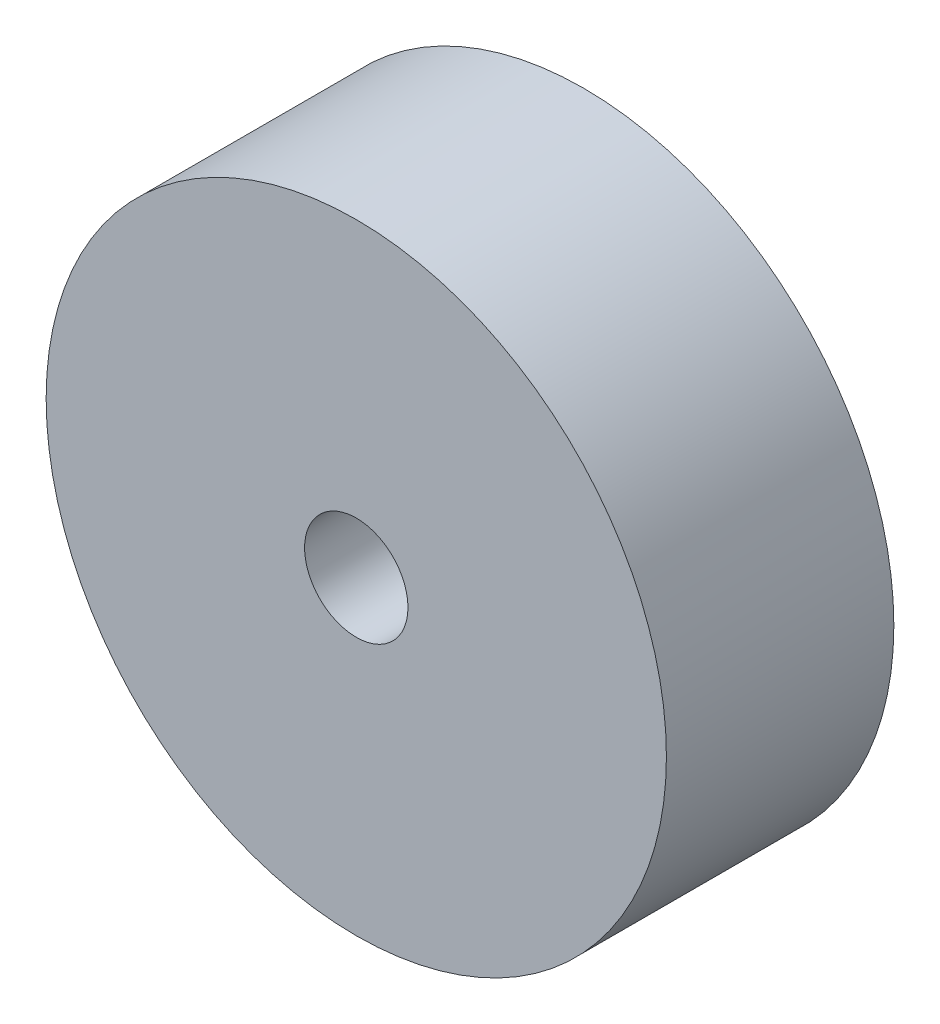
ISO-10303-21;
HEADER;
FILE_DESCRIPTION(('STEP AP214'),'2;1');
FILE_NAME('part.step','',(''),(''),'','','');
FILE_SCHEMA(('AUTOMOTIVE_DESIGN { 1 0 10303 214 1 1 1 1 }'));
ENDSEC;
DATA;
#1=APPLICATION_CONTEXT('core data for automotive mechanical design processes');
#2=APPLICATION_PROTOCOL_DEFINITION('international standard','automotive_design',2000,#1);
#3=PRODUCT_CONTEXT('',#1,'mechanical');
#4=PRODUCT('Part','Part','',(#3));
#5=PRODUCT_RELATED_PRODUCT_CATEGORY('part','',(#4));
#6=PRODUCT_DEFINITION_FORMATION('','',#4);
#7=PRODUCT_DEFINITION_CONTEXT('part definition',#1,'design');
#8=PRODUCT_DEFINITION('design','',#6,#7);
#9=PRODUCT_DEFINITION_SHAPE('','',#8);
#10=(LENGTH_UNIT() NAMED_UNIT(*) SI_UNIT(.MILLI.,.METRE.));
#11=(NAMED_UNIT(*) PLANE_ANGLE_UNIT() SI_UNIT($,.RADIAN.));
#12=(NAMED_UNIT(*) SI_UNIT($,.STERADIAN.) SOLID_ANGLE_UNIT());
#13=UNCERTAINTY_MEASURE_WITH_UNIT(LENGTH_MEASURE(1.E-05),#10,'distance_accuracy_value','');
#14=(GEOMETRIC_REPRESENTATION_CONTEXT(3) GLOBAL_UNCERTAINTY_ASSIGNED_CONTEXT((#13)) GLOBAL_UNIT_ASSIGNED_CONTEXT((#10,
#11,#12)) REPRESENTATION_CONTEXT('',''));
#15=CARTESIAN_POINT('',(0.,0.,0.));
#16=DIRECTION('',(0.,0.,1.));
#17=DIRECTION('',(1.,0.,0.));
#18=AXIS2_PLACEMENT_3D('',#15,#16,#17);
#19=CARTESIAN_POINT('',(-13.9028833057808,4.64519847288133,5.5));
#20=DIRECTION('',(0.,0.,1.));
#21=DIRECTION('',(1.,0.,0.));
#22=AXIS2_PLACEMENT_3D('',#19,#20,#21);
#23=PLANE('',#22);
#24=CARTESIAN_POINT('',(-13.9028833057808,4.64519847288133,5.5));
#25=DIRECTION('',(0.,0.,1.));
#26=DIRECTION('',(1.,0.,0.));
#27=AXIS2_PLACEMENT_3D('',#24,#25,#26);
#28=CIRCLE('',#27,7.5);
#29=CARTESIAN_POINT('',(-6.40288330578081,4.64519847288133,5.5));
#30=VERTEX_POINT('',#29);
#31=EDGE_CURVE('E10',#30,#30,#28,.T.);
#32=ORIENTED_EDGE('',*,*,#31,.T.);
#33=EDGE_LOOP('',(#32));
#34=FACE_BOUND('',#33,.T.);
#35=CARTESIAN_POINT('',(-13.9028833057808,4.64519847288133,5.5));
#36=DIRECTION('',(0.,0.,1.));
#37=DIRECTION('',(1.,0.,0.));
#38=AXIS2_PLACEMENT_3D('',#35,#36,#37);
#39=CIRCLE('',#38,1.25);
#40=CARTESIAN_POINT('',(-12.6528833057808,4.64519847288133,5.5));
#41=VERTEX_POINT('',#40);
#42=EDGE_CURVE('E41',#41,#41,#39,.T.);
#43=ORIENTED_EDGE('',*,*,#42,.F.);
#44=EDGE_LOOP('',(#43));
#45=FACE_BOUND('',#44,.T.);
#46=ADVANCED_FACE('F30',(#34,#45),#23,.T.);
#47=CARTESIAN_POINT('',(-13.9028833057808,4.64519847288133,0.));
#48=DIRECTION('',(0.,0.,1.));
#49=DIRECTION('',(1.,0.,0.));
#50=AXIS2_PLACEMENT_3D('',#47,#48,#49);
#51=PLANE('',#50);
#52=CARTESIAN_POINT('',(-13.9028833057808,4.64519847288133,0.));
#53=DIRECTION('',(0.,0.,1.));
#54=DIRECTION('',(1.,0.,0.));
#55=AXIS2_PLACEMENT_3D('',#52,#53,#54);
#56=CIRCLE('',#55,7.5);
#57=CARTESIAN_POINT('',(-6.40288330578081,4.64519847288133,0.));
#58=VERTEX_POINT('',#57);
#59=EDGE_CURVE('E34',#58,#58,#56,.T.);
#60=ORIENTED_EDGE('',*,*,#59,.F.);
#61=EDGE_LOOP('',(#60));
#62=FACE_BOUND('',#61,.T.);
#63=CARTESIAN_POINT('',(-13.9028833057808,4.64519847288133,0.));
#64=DIRECTION('',(0.,0.,1.));
#65=DIRECTION('',(1.,0.,0.));
#66=AXIS2_PLACEMENT_3D('',#63,#64,#65);
#67=CIRCLE('',#66,1.25);
#68=CARTESIAN_POINT('',(-12.6528833057808,4.64519847288133,0.));
#69=VERTEX_POINT('',#68);
#70=EDGE_CURVE('E43',#69,#69,#67,.T.);
#71=ORIENTED_EDGE('',*,*,#70,.T.);
#72=EDGE_LOOP('',(#71));
#73=FACE_BOUND('',#72,.T.);
#74=ADVANCED_FACE('F53',(#62,#73),#51,.F.);
#75=CARTESIAN_POINT('',(-13.9028833057808,4.64519847288133,5.5));
#76=DIRECTION('',(0.,0.,-1.));
#77=DIRECTION('',(-1.,0.,0.));
#78=AXIS2_PLACEMENT_3D('',#75,#76,#77);
#79=CYLINDRICAL_SURFACE('',#78,7.5);
#80=ORIENTED_EDGE('',*,*,#31,.F.);
#81=EDGE_LOOP('',(#80));
#82=FACE_BOUND('',#81,.T.);
#83=ORIENTED_EDGE('',*,*,#59,.T.);
#84=EDGE_LOOP('',(#83));
#85=FACE_BOUND('',#84,.T.);
#86=ADVANCED_FACE('F32',(#82,#85),#79,.T.);
#87=CARTESIAN_POINT('',(-13.9028833057808,4.64519847288133,5.5));
#88=DIRECTION('',(0.,0.,-1.));
#89=DIRECTION('',(-1.,0.,0.));
#90=AXIS2_PLACEMENT_3D('',#87,#88,#89);
#91=CYLINDRICAL_SURFACE('',#90,1.25);
#92=ORIENTED_EDGE('',*,*,#42,.T.);
#93=EDGE_LOOP('',(#92));
#94=FACE_BOUND('',#93,.T.);
#95=ORIENTED_EDGE('',*,*,#70,.F.);
#96=EDGE_LOOP('',(#95));
#97=FACE_BOUND('',#96,.T.);
#98=ADVANCED_FACE('F49',(#94,#97),#91,.F.);
#99=CLOSED_SHELL('',(#46,#74,#86,#98));
#100=MANIFOLD_SOLID_BREP('B2',#99);
#101=ADVANCED_BREP_SHAPE_REPRESENTATION('',(#18,#100),#14);
#102=SHAPE_DEFINITION_REPRESENTATION(#9,#101);
ENDSEC;
END-ISO-10303-21;
